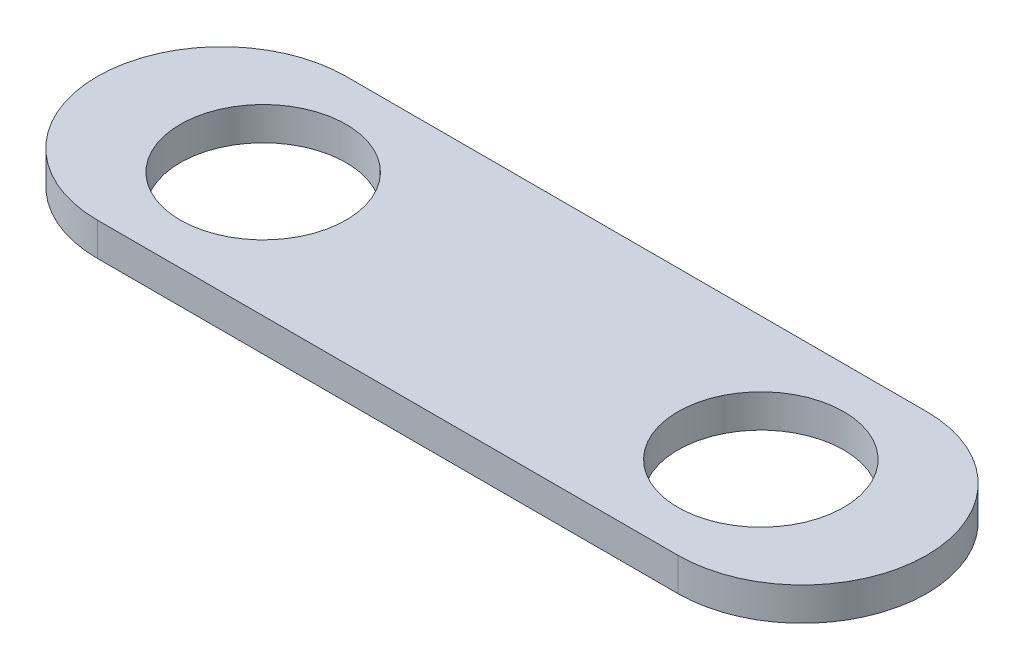
ISO-10303-21;
HEADER;
FILE_DESCRIPTION(('STEP AP214'),'2;1');
FILE_NAME('part.step','',(''),(''),'','','');
FILE_SCHEMA(('AUTOMOTIVE_DESIGN { 1 0 10303 214 1 1 1 1 }'));
ENDSEC;
DATA;
#1=APPLICATION_CONTEXT('core data for automotive mechanical design processes');
#2=APPLICATION_PROTOCOL_DEFINITION('international standard','automotive_design',2000,#1);
#3=PRODUCT_CONTEXT('',#1,'mechanical');
#4=PRODUCT('Part','Part','',(#3));
#5=PRODUCT_RELATED_PRODUCT_CATEGORY('part','',(#4));
#6=PRODUCT_DEFINITION_FORMATION('','',#4);
#7=PRODUCT_DEFINITION_CONTEXT('part definition',#1,'design');
#8=PRODUCT_DEFINITION('design','',#6,#7);
#9=PRODUCT_DEFINITION_SHAPE('','',#8);
#10=(LENGTH_UNIT() NAMED_UNIT(*) SI_UNIT(.MILLI.,.METRE.));
#11=(NAMED_UNIT(*) PLANE_ANGLE_UNIT() SI_UNIT($,.RADIAN.));
#12=(NAMED_UNIT(*) SI_UNIT($,.STERADIAN.) SOLID_ANGLE_UNIT());
#13=UNCERTAINTY_MEASURE_WITH_UNIT(LENGTH_MEASURE(1.E-05),#10,'distance_accuracy_value','');
#14=(GEOMETRIC_REPRESENTATION_CONTEXT(3) GLOBAL_UNCERTAINTY_ASSIGNED_CONTEXT((#13)) GLOBAL_UNIT_ASSIGNED_CONTEXT((#10,
#11,#12)) REPRESENTATION_CONTEXT('',''));
#15=CARTESIAN_POINT('',(0.,0.,0.));
#16=DIRECTION('',(0.,0.,1.));
#17=DIRECTION('',(1.,0.,0.));
#18=AXIS2_PLACEMENT_3D('',#15,#16,#17);
#19=CARTESIAN_POINT('',(0.,2.,0.));
#20=DIRECTION('',(0.,0.,-1.));
#21=DIRECTION('',(-1.,0.,0.));
#22=AXIS2_PLACEMENT_3D('',#19,#20,#21);
#23=PLANE('',#22);
#24=DIRECTION('',(0.,1.,0.));
#25=VECTOR('',#24,1.);
#26=CARTESIAN_POINT('',(7.5,0.,0.));
#27=LINE('',#26,#25);
#28=CARTESIAN_POINT('',(7.5,0.,0.));
#29=VERTEX_POINT('',#28);
#30=CARTESIAN_POINT('',(7.5,2.,0.));
#31=VERTEX_POINT('',#30);
#32=EDGE_CURVE('E86',#29,#31,#27,.T.);
#33=ORIENTED_EDGE('',*,*,#32,.F.);
#34=DIRECTION('',(1.,0.,0.));
#35=VECTOR('',#34,1.);
#36=CARTESIAN_POINT('',(0.,0.,0.));
#37=LINE('',#36,#35);
#38=CARTESIAN_POINT('',(42.4999999999998,0.,0.));
#39=VERTEX_POINT('',#38);
#40=EDGE_CURVE('E55',#29,#39,#37,.T.);
#41=ORIENTED_EDGE('',*,*,#40,.T.);
#42=DIRECTION('',(0.,1.,0.));
#43=VECTOR('',#42,1.);
#44=CARTESIAN_POINT('',(42.4999999999998,0.,0.));
#45=LINE('',#44,#43);
#46=CARTESIAN_POINT('',(42.4999999999998,2.,0.));
#47=VERTEX_POINT('',#46);
#48=EDGE_CURVE('E112',#39,#47,#45,.T.);
#49=ORIENTED_EDGE('',*,*,#48,.T.);
#50=DIRECTION('',(1.,0.,0.));
#51=VECTOR('',#50,1.);
#52=CARTESIAN_POINT('',(0.,2.,0.));
#53=LINE('',#52,#51);
#54=EDGE_CURVE('E47',#31,#47,#53,.T.);
#55=ORIENTED_EDGE('',*,*,#54,.F.);
#56=EDGE_LOOP('',(#33,#41,#49,#55));
#57=FACE_BOUND('',#56,.T.);
#58=ADVANCED_FACE('F39',(#57),#23,.F.);
#59=CARTESIAN_POINT('',(0.,2.,0.));
#60=DIRECTION('',(0.,-1.,0.));
#61=DIRECTION('',(0.,0.,-1.));
#62=AXIS2_PLACEMENT_3D('',#59,#60,#61);
#63=PLANE('',#62);
#64=CARTESIAN_POINT('',(7.5,2.,-7.5));
#65=DIRECTION('',(0.,1.,0.));
#66=DIRECTION('',(0.,0.,1.));
#67=AXIS2_PLACEMENT_3D('',#64,#65,#66);
#68=CIRCLE('',#67,7.5);
#69=CARTESIAN_POINT('',(7.5,2.,-15.));
#70=VERTEX_POINT('',#69);
#71=EDGE_CURVE('E90',#70,#31,#68,.T.);
#72=ORIENTED_EDGE('',*,*,#71,.T.);
#73=ORIENTED_EDGE('',*,*,#54,.T.);
#74=CARTESIAN_POINT('',(42.4999999999998,2.,-7.5));
#75=DIRECTION('',(0.,1.,0.));
#76=DIRECTION('',(0.,0.,1.));
#77=AXIS2_PLACEMENT_3D('',#74,#75,#76);
#78=CIRCLE('',#77,7.5);
#79=CARTESIAN_POINT('',(42.4999999999998,2.,-15.));
#80=VERTEX_POINT('',#79);
#81=EDGE_CURVE('E92',#80,#47,#78,.F.);
#82=ORIENTED_EDGE('',*,*,#81,.F.);
#83=DIRECTION('',(-1.,0.,0.));
#84=VECTOR('',#83,1.);
#85=CARTESIAN_POINT('',(0.,2.,-15.));
#86=LINE('',#85,#84);
#87=EDGE_CURVE('E11',#80,#70,#86,.T.);
#88=ORIENTED_EDGE('',*,*,#87,.T.);
#89=EDGE_LOOP('',(#72,#73,#82,#88));
#90=FACE_BOUND('',#89,.T.);
#91=CARTESIAN_POINT('',(10.,2.,-7.5));
#92=DIRECTION('',(0.,1.,0.));
#93=DIRECTION('',(0.,0.,1.));
#94=AXIS2_PLACEMENT_3D('',#91,#92,#93);
#95=CIRCLE('',#94,5.);
#96=CARTESIAN_POINT('',(10.,2.,-2.5));
#97=VERTEX_POINT('',#96);
#98=EDGE_CURVE('E100',#97,#97,#95,.T.);
#99=ORIENTED_EDGE('',*,*,#98,.F.);
#100=EDGE_LOOP('',(#99));
#101=FACE_BOUND('',#100,.T.);
#102=CARTESIAN_POINT('',(39.9999999999998,2.,-7.5));
#103=DIRECTION('',(0.,1.,0.));
#104=DIRECTION('',(0.,0.,-1.));
#105=AXIS2_PLACEMENT_3D('',#102,#103,#104);
#106=CIRCLE('',#105,5.);
#107=CARTESIAN_POINT('',(39.9999999999998,2.,-12.5));
#108=VERTEX_POINT('',#107);
#109=EDGE_CURVE('E104',#108,#108,#106,.T.);
#110=ORIENTED_EDGE('',*,*,#109,.F.);
#111=EDGE_LOOP('',(#110));
#112=FACE_BOUND('',#111,.T.);
#113=ADVANCED_FACE('F125',(#90,#101,#112),#63,.F.);
#114=CARTESIAN_POINT('',(0.,0.,0.));
#115=DIRECTION('',(0.,-1.,0.));
#116=DIRECTION('',(0.,0.,-1.));
#117=AXIS2_PLACEMENT_3D('',#114,#115,#116);
#118=PLANE('',#117);
#119=CARTESIAN_POINT('',(10.,0.,-7.5));
#120=DIRECTION('',(0.,1.,0.));
#121=DIRECTION('',(0.,0.,1.));
#122=AXIS2_PLACEMENT_3D('',#119,#120,#121);
#123=CIRCLE('',#122,5.);
#124=CARTESIAN_POINT('',(10.,0.,-2.5));
#125=VERTEX_POINT('',#124);
#126=EDGE_CURVE('E98',#125,#125,#123,.T.);
#127=ORIENTED_EDGE('',*,*,#126,.T.);
#128=EDGE_LOOP('',(#127));
#129=FACE_BOUND('',#128,.T.);
#130=CARTESIAN_POINT('',(39.9999999999998,0.,-7.5));
#131=DIRECTION('',(0.,1.,0.));
#132=DIRECTION('',(0.,0.,-1.));
#133=AXIS2_PLACEMENT_3D('',#130,#131,#132);
#134=CIRCLE('',#133,5.);
#135=CARTESIAN_POINT('',(39.9999999999998,0.,-12.5));
#136=VERTEX_POINT('',#135);
#137=EDGE_CURVE('E107',#136,#136,#134,.T.);
#138=ORIENTED_EDGE('',*,*,#137,.T.);
#139=EDGE_LOOP('',(#138));
#140=FACE_BOUND('',#139,.T.);
#141=ORIENTED_EDGE('',*,*,#40,.F.);
#142=CARTESIAN_POINT('',(7.5,0.,-7.5));
#143=DIRECTION('',(0.,1.,0.));
#144=DIRECTION('',(0.,0.,1.));
#145=AXIS2_PLACEMENT_3D('',#142,#143,#144);
#146=CIRCLE('',#145,7.5);
#147=CARTESIAN_POINT('',(7.5,0.,-15.));
#148=VERTEX_POINT('',#147);
#149=EDGE_CURVE('E83',#148,#29,#146,.T.);
#150=ORIENTED_EDGE('',*,*,#149,.F.);
#151=DIRECTION('',(-1.,0.,0.));
#152=VECTOR('',#151,1.);
#153=CARTESIAN_POINT('',(0.,0.,-15.));
#154=LINE('',#153,#152);
#155=CARTESIAN_POINT('',(42.4999999999998,0.,-15.));
#156=VERTEX_POINT('',#155);
#157=EDGE_CURVE('E42',#156,#148,#154,.T.);
#158=ORIENTED_EDGE('',*,*,#157,.F.);
#159=CARTESIAN_POINT('',(42.4999999999998,0.,-7.5));
#160=DIRECTION('',(0.,1.,0.));
#161=DIRECTION('',(0.,0.,1.));
#162=AXIS2_PLACEMENT_3D('',#159,#160,#161);
#163=CIRCLE('',#162,7.5);
#164=EDGE_CURVE('E97',#156,#39,#163,.F.);
#165=ORIENTED_EDGE('',*,*,#164,.T.);
#166=EDGE_LOOP('',(#141,#150,#158,#165));
#167=FACE_BOUND('',#166,.T.);
#168=ADVANCED_FACE('F96',(#129,#140,#167),#118,.T.);
#169=CARTESIAN_POINT('',(0.,2.,-15.));
#170=DIRECTION('',(0.,0.,1.));
#171=DIRECTION('',(1.,0.,0.));
#172=AXIS2_PLACEMENT_3D('',#169,#170,#171);
#173=PLANE('',#172);
#174=ORIENTED_EDGE('',*,*,#87,.F.);
#175=DIRECTION('',(0.,1.,0.));
#176=VECTOR('',#175,1.);
#177=CARTESIAN_POINT('',(42.4999999999998,0.,-15.));
#178=LINE('',#177,#176);
#179=EDGE_CURVE('E93',#156,#80,#178,.T.);
#180=ORIENTED_EDGE('',*,*,#179,.F.);
#181=ORIENTED_EDGE('',*,*,#157,.T.);
#182=DIRECTION('',(0.,1.,0.));
#183=VECTOR('',#182,1.);
#184=CARTESIAN_POINT('',(7.5,0.,-15.));
#185=LINE('',#184,#183);
#186=EDGE_CURVE('E88',#148,#70,#185,.T.);
#187=ORIENTED_EDGE('',*,*,#186,.T.);
#188=EDGE_LOOP('',(#174,#180,#181,#187));
#189=FACE_BOUND('',#188,.T.);
#190=ADVANCED_FACE('F123',(#189),#173,.F.);
#191=CARTESIAN_POINT('',(39.9999999999998,0.,-7.5));
#192=DIRECTION('',(0.,1.,0.));
#193=DIRECTION('',(0.,0.,1.));
#194=AXIS2_PLACEMENT_3D('',#191,#192,#193);
#195=CYLINDRICAL_SURFACE('',#194,5.);
#196=ORIENTED_EDGE('',*,*,#137,.F.);
#197=EDGE_LOOP('',(#196));
#198=FACE_BOUND('',#197,.T.);
#199=ORIENTED_EDGE('',*,*,#109,.T.);
#200=EDGE_LOOP('',(#199));
#201=FACE_BOUND('',#200,.T.);
#202=ADVANCED_FACE('F133',(#198,#201),#195,.F.);
#203=CARTESIAN_POINT('',(10.,0.,-7.5));
#204=DIRECTION('',(0.,1.,0.));
#205=DIRECTION('',(0.,0.,1.));
#206=AXIS2_PLACEMENT_3D('',#203,#204,#205);
#207=CYLINDRICAL_SURFACE('',#206,5.);
#208=ORIENTED_EDGE('',*,*,#126,.F.);
#209=EDGE_LOOP('',(#208));
#210=FACE_BOUND('',#209,.T.);
#211=ORIENTED_EDGE('',*,*,#98,.T.);
#212=EDGE_LOOP('',(#211));
#213=FACE_BOUND('',#212,.T.);
#214=ADVANCED_FACE('F135',(#210,#213),#207,.F.);
#215=CARTESIAN_POINT('',(42.4999999999998,0.,-7.5));
#216=DIRECTION('',(0.,1.,0.));
#217=DIRECTION('',(0.,0.,1.));
#218=AXIS2_PLACEMENT_3D('',#215,#216,#217);
#219=CYLINDRICAL_SURFACE('',#218,7.5);
#220=ORIENTED_EDGE('',*,*,#81,.T.);
#221=ORIENTED_EDGE('',*,*,#48,.F.);
#222=ORIENTED_EDGE('',*,*,#164,.F.);
#223=ORIENTED_EDGE('',*,*,#179,.T.);
#224=EDGE_LOOP('',(#220,#221,#222,#223));
#225=FACE_BOUND('',#224,.T.);
#226=ADVANCED_FACE('F122',(#225),#219,.T.);
#227=CARTESIAN_POINT('',(7.5,0.,-7.5));
#228=DIRECTION('',(0.,1.,0.));
#229=DIRECTION('',(0.,0.,1.));
#230=AXIS2_PLACEMENT_3D('',#227,#228,#229);
#231=CYLINDRICAL_SURFACE('',#230,7.5);
#232=ORIENTED_EDGE('',*,*,#71,.F.);
#233=ORIENTED_EDGE('',*,*,#186,.F.);
#234=ORIENTED_EDGE('',*,*,#149,.T.);
#235=ORIENTED_EDGE('',*,*,#32,.T.);
#236=EDGE_LOOP('',(#232,#233,#234,#235));
#237=FACE_BOUND('',#236,.T.);
#238=ADVANCED_FACE('F85',(#237),#231,.T.);
#239=CLOSED_SHELL('',(#58,#113,#168,#190,#202,#214,#226,#238));
#240=MANIFOLD_SOLID_BREP('B2',#239);
#241=ADVANCED_BREP_SHAPE_REPRESENTATION('',(#18,#240),#14);
#242=SHAPE_DEFINITION_REPRESENTATION(#9,#241);
ENDSEC;
END-ISO-10303-21;
